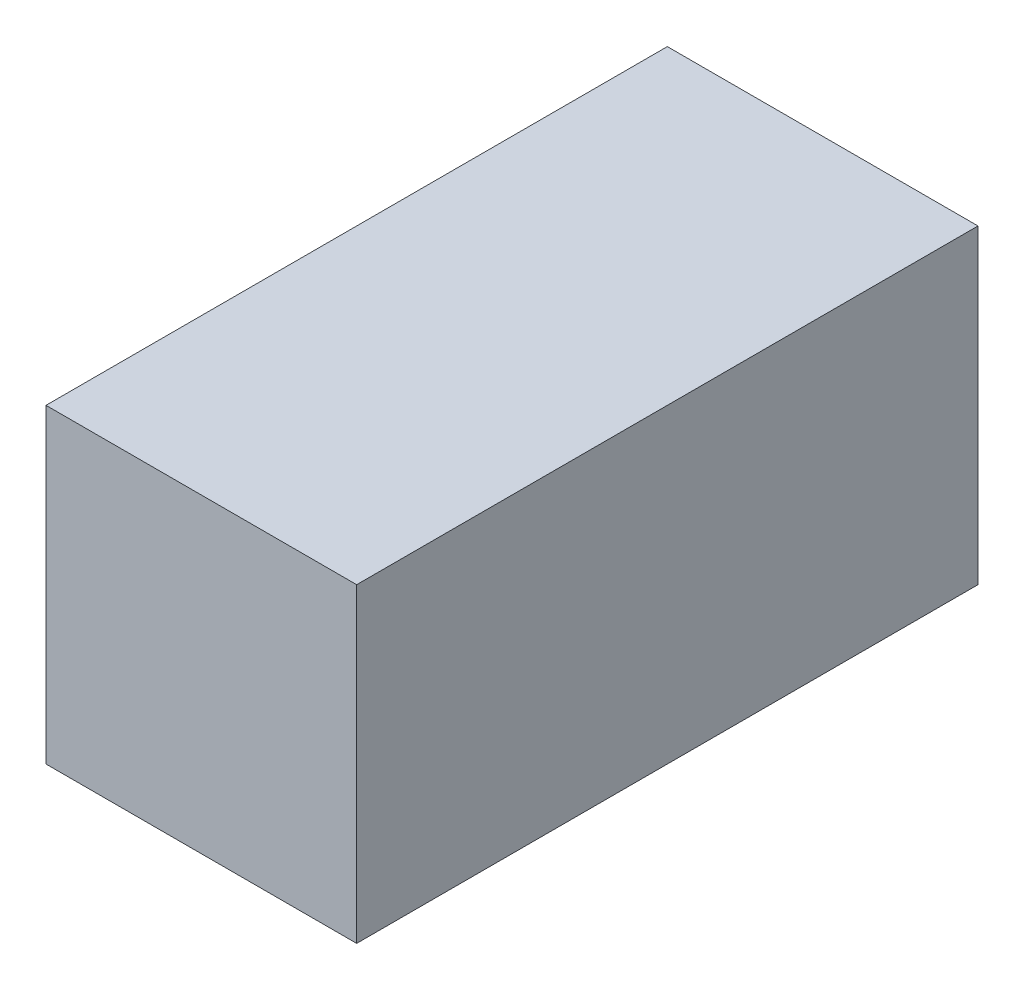
ISO-10303-21;
HEADER;
FILE_DESCRIPTION(('STEP AP214'),'2;1');
FILE_NAME('part.step','',(''),(''),'','','');
FILE_SCHEMA(('AUTOMOTIVE_DESIGN { 1 0 10303 214 1 1 1 1 }'));
ENDSEC;
DATA;
#1=APPLICATION_CONTEXT('core data for automotive mechanical design processes');
#2=APPLICATION_PROTOCOL_DEFINITION('international standard','automotive_design',2000,#1);
#3=PRODUCT_CONTEXT('',#1,'mechanical');
#4=PRODUCT('Part','Part','',(#3));
#5=PRODUCT_RELATED_PRODUCT_CATEGORY('part','',(#4));
#6=PRODUCT_DEFINITION_FORMATION('','',#4);
#7=PRODUCT_DEFINITION_CONTEXT('part definition',#1,'design');
#8=PRODUCT_DEFINITION('design','',#6,#7);
#9=PRODUCT_DEFINITION_SHAPE('','',#8);
#10=(LENGTH_UNIT() NAMED_UNIT(*) SI_UNIT(.MILLI.,.METRE.));
#11=(NAMED_UNIT(*) PLANE_ANGLE_UNIT() SI_UNIT($,.RADIAN.));
#12=(NAMED_UNIT(*) SI_UNIT($,.STERADIAN.) SOLID_ANGLE_UNIT());
#13=UNCERTAINTY_MEASURE_WITH_UNIT(LENGTH_MEASURE(1.E-05),#10,'distance_accuracy_value','');
#14=(GEOMETRIC_REPRESENTATION_CONTEXT(3) GLOBAL_UNCERTAINTY_ASSIGNED_CONTEXT((#13)) GLOBAL_UNIT_ASSIGNED_CONTEXT((#10,
#11,#12)) REPRESENTATION_CONTEXT('',''));
#15=CARTESIAN_POINT('',(0.,0.,0.));
#16=DIRECTION('',(0.,0.,1.));
#17=DIRECTION('',(1.,0.,0.));
#18=AXIS2_PLACEMENT_3D('',#15,#16,#17);
#19=CARTESIAN_POINT('',(6.43396209301866,18.5853140916808,-50.));
#20=DIRECTION('',(1.,0.,0.));
#21=DIRECTION('',(0.,1.,0.));
#22=AXIS2_PLACEMENT_3D('',#19,#20,#21);
#23=PLANE('',#22);
#24=DIRECTION('',(0.,1.,0.));
#25=VECTOR('',#24,1.);
#26=CARTESIAN_POINT('',(6.43396209301866,18.5853140916808,0.));
#27=LINE('',#26,#25);
#28=CARTESIAN_POINT('',(6.43396209301866,-6.41468590831919,0.));
#29=VERTEX_POINT('',#28);
#30=CARTESIAN_POINT('',(6.43396209301866,18.5853140916808,0.));
#31=VERTEX_POINT('',#30);
#32=EDGE_CURVE('E97',#29,#31,#27,.T.);
#33=ORIENTED_EDGE('',*,*,#32,.F.);
#34=DIRECTION('',(0.,0.,1.));
#35=VECTOR('',#34,1.);
#36=CARTESIAN_POINT('',(6.43396209301866,-6.41468590831919,-50.));
#37=LINE('',#36,#35);
#38=CARTESIAN_POINT('',(6.43396209301866,-6.41468590831919,-50.));
#39=VERTEX_POINT('',#38);
#40=EDGE_CURVE('E11',#39,#29,#37,.T.);
#41=ORIENTED_EDGE('',*,*,#40,.F.);
#42=DIRECTION('',(0.,1.,0.));
#43=VECTOR('',#42,1.);
#44=CARTESIAN_POINT('',(6.43396209301866,18.5853140916808,-50.));
#45=LINE('',#44,#43);
#46=CARTESIAN_POINT('',(6.43396209301866,18.5853140916808,-50.));
#47=VERTEX_POINT('',#46);
#48=EDGE_CURVE('E91',#39,#47,#45,.T.);
#49=ORIENTED_EDGE('',*,*,#48,.T.);
#50=DIRECTION('',(0.,0.,1.));
#51=VECTOR('',#50,1.);
#52=CARTESIAN_POINT('',(6.43396209301866,18.5853140916808,-50.));
#53=LINE('',#52,#51);
#54=EDGE_CURVE('E36',#47,#31,#53,.T.);
#55=ORIENTED_EDGE('',*,*,#54,.T.);
#56=EDGE_LOOP('',(#33,#41,#49,#55));
#57=FACE_BOUND('',#56,.T.);
#58=ADVANCED_FACE('F33',(#57),#23,.T.);
#59=CARTESIAN_POINT('',(-18.5660379069813,-6.41468590831919,-50.));
#60=DIRECTION('',(0.,-1.,0.));
#61=DIRECTION('',(0.,0.,-1.));
#62=AXIS2_PLACEMENT_3D('',#59,#60,#61);
#63=PLANE('',#62);
#64=DIRECTION('',(1.,0.,0.));
#65=VECTOR('',#64,1.);
#66=CARTESIAN_POINT('',(-18.5660379069813,-6.41468590831919,0.));
#67=LINE('',#66,#65);
#68=CARTESIAN_POINT('',(-18.5660379069813,-6.41468590831919,0.));
#69=VERTEX_POINT('',#68);
#70=EDGE_CURVE('E93',#69,#29,#67,.T.);
#71=ORIENTED_EDGE('',*,*,#70,.F.);
#72=DIRECTION('',(0.,0.,1.));
#73=VECTOR('',#72,1.);
#74=CARTESIAN_POINT('',(-18.5660379069813,-6.41468590831919,-50.));
#75=LINE('',#74,#73);
#76=CARTESIAN_POINT('',(-18.5660379069813,-6.41468590831919,-50.));
#77=VERTEX_POINT('',#76);
#78=EDGE_CURVE('E42',#77,#69,#75,.T.);
#79=ORIENTED_EDGE('',*,*,#78,.F.);
#80=DIRECTION('',(1.,0.,0.));
#81=VECTOR('',#80,1.);
#82=CARTESIAN_POINT('',(-18.5660379069813,-6.41468590831919,-50.));
#83=LINE('',#82,#81);
#84=EDGE_CURVE('E88',#77,#39,#83,.T.);
#85=ORIENTED_EDGE('',*,*,#84,.T.);
#86=ORIENTED_EDGE('',*,*,#40,.T.);
#87=EDGE_LOOP('',(#71,#79,#85,#86));
#88=FACE_BOUND('',#87,.T.);
#89=ADVANCED_FACE('F107',(#88),#63,.T.);
#90=CARTESIAN_POINT('',(-18.5660379069813,18.5853140916808,-50.));
#91=DIRECTION('',(-1.,0.,0.));
#92=DIRECTION('',(0.,-1.,0.));
#93=AXIS2_PLACEMENT_3D('',#90,#91,#92);
#94=PLANE('',#93);
#95=DIRECTION('',(0.,-1.,0.));
#96=VECTOR('',#95,1.);
#97=CARTESIAN_POINT('',(-18.5660379069813,18.5853140916808,0.));
#98=LINE('',#97,#96);
#99=CARTESIAN_POINT('',(-18.5660379069813,18.5853140916808,0.));
#100=VERTEX_POINT('',#99);
#101=EDGE_CURVE('E83',#100,#69,#98,.T.);
#102=ORIENTED_EDGE('',*,*,#101,.F.);
#103=DIRECTION('',(0.,0.,1.));
#104=VECTOR('',#103,1.);
#105=CARTESIAN_POINT('',(-18.5660379069813,18.5853140916808,-50.));
#106=LINE('',#105,#104);
#107=CARTESIAN_POINT('',(-18.5660379069813,18.5853140916808,-50.));
#108=VERTEX_POINT('',#107);
#109=EDGE_CURVE('E78',#108,#100,#106,.T.);
#110=ORIENTED_EDGE('',*,*,#109,.F.);
#111=DIRECTION('',(0.,-1.,0.));
#112=VECTOR('',#111,1.);
#113=CARTESIAN_POINT('',(-18.5660379069813,18.5853140916808,-50.));
#114=LINE('',#113,#112);
#115=EDGE_CURVE('E81',#108,#77,#114,.T.);
#116=ORIENTED_EDGE('',*,*,#115,.T.);
#117=ORIENTED_EDGE('',*,*,#78,.T.);
#118=EDGE_LOOP('',(#102,#110,#116,#117));
#119=FACE_BOUND('',#118,.T.);
#120=ADVANCED_FACE('F80',(#119),#94,.T.);
#121=CARTESIAN_POINT('',(-18.5660379069813,18.5853140916808,-50.));
#122=DIRECTION('',(0.,1.,0.));
#123=DIRECTION('',(0.,0.,1.));
#124=AXIS2_PLACEMENT_3D('',#121,#122,#123);
#125=PLANE('',#124);
#126=DIRECTION('',(-1.,0.,0.));
#127=VECTOR('',#126,1.);
#128=CARTESIAN_POINT('',(-18.5660379069813,18.5853140916808,0.));
#129=LINE('',#128,#127);
#130=EDGE_CURVE('E100',#31,#100,#129,.T.);
#131=ORIENTED_EDGE('',*,*,#130,.F.);
#132=ORIENTED_EDGE('',*,*,#54,.F.);
#133=DIRECTION('',(-1.,0.,0.));
#134=VECTOR('',#133,1.);
#135=CARTESIAN_POINT('',(-18.5660379069813,18.5853140916808,-50.));
#136=LINE('',#135,#134);
#137=EDGE_CURVE('E87',#47,#108,#136,.T.);
#138=ORIENTED_EDGE('',*,*,#137,.T.);
#139=ORIENTED_EDGE('',*,*,#109,.T.);
#140=EDGE_LOOP('',(#131,#132,#138,#139));
#141=FACE_BOUND('',#140,.T.);
#142=ADVANCED_FACE('F90',(#141),#125,.T.);
#143=CARTESIAN_POINT('',(0.,0.,-50.));
#144=DIRECTION('',(0.,0.,1.));
#145=DIRECTION('',(1.,0.,0.));
#146=AXIS2_PLACEMENT_3D('',#143,#144,#145);
#147=PLANE('',#146);
#148=ORIENTED_EDGE('',*,*,#48,.F.);
#149=ORIENTED_EDGE('',*,*,#84,.F.);
#150=ORIENTED_EDGE('',*,*,#115,.F.);
#151=ORIENTED_EDGE('',*,*,#137,.F.);
#152=EDGE_LOOP('',(#148,#149,#150,#151));
#153=FACE_BOUND('',#152,.T.);
#154=ADVANCED_FACE('F86',(#153),#147,.F.);
#155=CARTESIAN_POINT('',(0.,0.,0.));
#156=DIRECTION('',(0.,0.,1.));
#157=DIRECTION('',(1.,0.,0.));
#158=AXIS2_PLACEMENT_3D('',#155,#156,#157);
#159=PLANE('',#158);
#160=ORIENTED_EDGE('',*,*,#32,.T.);
#161=ORIENTED_EDGE('',*,*,#130,.T.);
#162=ORIENTED_EDGE('',*,*,#101,.T.);
#163=ORIENTED_EDGE('',*,*,#70,.T.);
#164=EDGE_LOOP('',(#160,#161,#162,#163));
#165=FACE_BOUND('',#164,.T.);
#166=ADVANCED_FACE('F106',(#165),#159,.T.);
#167=CLOSED_SHELL('',(#58,#89,#120,#142,#154,#166));
#168=MANIFOLD_SOLID_BREP('B2',#167);
#169=ADVANCED_BREP_SHAPE_REPRESENTATION('',(#18,#168),#14);
#170=SHAPE_DEFINITION_REPRESENTATION(#9,#169);
ENDSEC;
END-ISO-10303-21;
